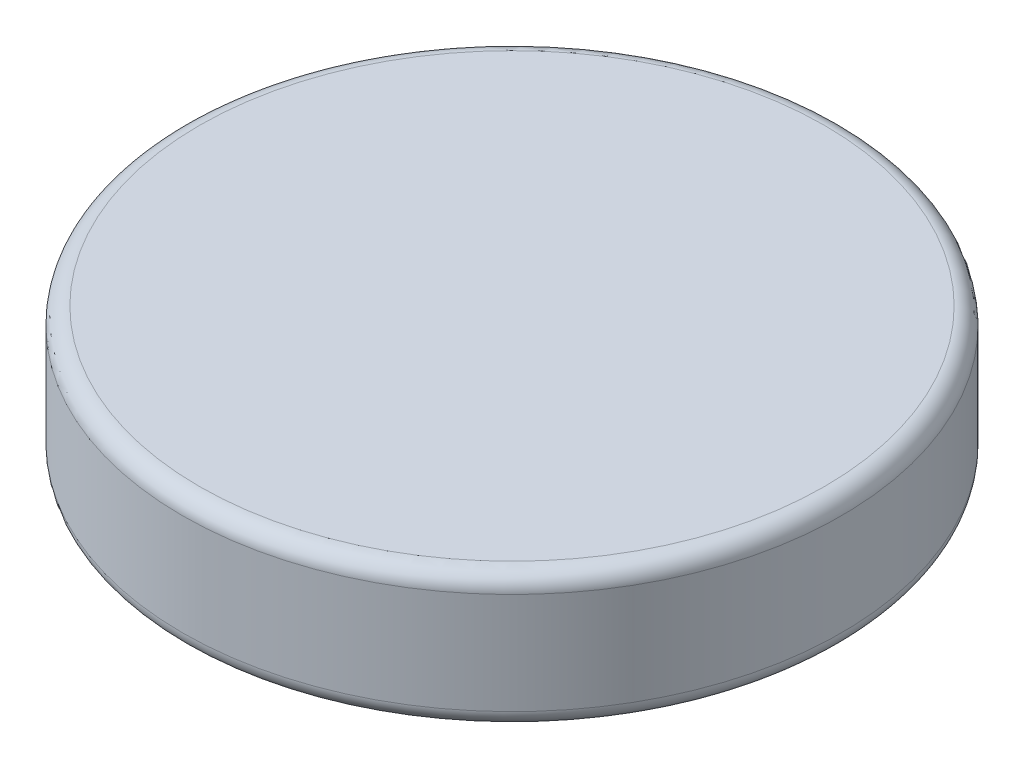
ISO-10303-21;
HEADER;
FILE_DESCRIPTION(('STEP AP214'),'2;1');
FILE_NAME('part.step','',(''),(''),'','','');
FILE_SCHEMA(('AUTOMOTIVE_DESIGN { 1 0 10303 214 1 1 1 1 }'));
ENDSEC;
DATA;
#1=APPLICATION_CONTEXT('core data for automotive mechanical design processes');
#2=APPLICATION_PROTOCOL_DEFINITION('international standard','automotive_design',2000,#1);
#3=PRODUCT_CONTEXT('',#1,'mechanical');
#4=PRODUCT('Part','Part','',(#3));
#5=PRODUCT_RELATED_PRODUCT_CATEGORY('part','',(#4));
#6=PRODUCT_DEFINITION_FORMATION('','',#4);
#7=PRODUCT_DEFINITION_CONTEXT('part definition',#1,'design');
#8=PRODUCT_DEFINITION('design','',#6,#7);
#9=PRODUCT_DEFINITION_SHAPE('','',#8);
#10=(LENGTH_UNIT() NAMED_UNIT(*) SI_UNIT(.MILLI.,.METRE.));
#11=(NAMED_UNIT(*) PLANE_ANGLE_UNIT() SI_UNIT($,.RADIAN.));
#12=(NAMED_UNIT(*) SI_UNIT($,.STERADIAN.) SOLID_ANGLE_UNIT());
#13=UNCERTAINTY_MEASURE_WITH_UNIT(LENGTH_MEASURE(1.E-05),#10,'distance_accuracy_value','');
#14=(GEOMETRIC_REPRESENTATION_CONTEXT(3) GLOBAL_UNCERTAINTY_ASSIGNED_CONTEXT((#13)) GLOBAL_UNIT_ASSIGNED_CONTEXT((#10,
#11,#12)) REPRESENTATION_CONTEXT('',''));
#15=CARTESIAN_POINT('',(0.,0.,0.));
#16=DIRECTION('',(0.,0.,1.));
#17=DIRECTION('',(1.,0.,0.));
#18=AXIS2_PLACEMENT_3D('',#15,#16,#17);
#19=CARTESIAN_POINT('',(0.,2.032,0.));
#20=DIRECTION('',(0.,-1.,0.));
#21=DIRECTION('',(0.,0.,-1.));
#22=AXIS2_PLACEMENT_3D('',#19,#20,#21);
#23=CYLINDRICAL_SURFACE('',#22,4.953);
#24=CARTESIAN_POINT('',(0.,0.254,0.));
#25=DIRECTION('',(0.,1.,0.));
#26=DIRECTION('',(0.,0.,1.));
#27=AXIS2_PLACEMENT_3D('',#24,#25,#26);
#28=CIRCLE('',#27,4.953);
#29=CARTESIAN_POINT('',(0.,0.254,4.953));
#30=VERTEX_POINT('',#29);
#31=EDGE_CURVE('E53',#30,#30,#28,.T.);
#32=ORIENTED_EDGE('',*,*,#31,.T.);
#33=EDGE_LOOP('',(#32));
#34=FACE_BOUND('',#33,.T.);
#35=CARTESIAN_POINT('',(0.,1.778,0.));
#36=DIRECTION('',(0.,1.,0.));
#37=DIRECTION('',(0.,0.,1.));
#38=AXIS2_PLACEMENT_3D('',#35,#36,#37);
#39=CIRCLE('',#38,4.953);
#40=CARTESIAN_POINT('',(0.,1.778,4.953));
#41=VERTEX_POINT('',#40);
#42=EDGE_CURVE('E58',#41,#41,#39,.F.);
#43=ORIENTED_EDGE('',*,*,#42,.T.);
#44=EDGE_LOOP('',(#43));
#45=FACE_BOUND('',#44,.T.);
#46=ADVANCED_FACE('F40',(#34,#45),#23,.T.);
#47=CARTESIAN_POINT('',(0.,2.032,0.));
#48=DIRECTION('',(0.,1.,0.));
#49=DIRECTION('',(0.,0.,1.));
#50=AXIS2_PLACEMENT_3D('',#47,#48,#49);
#51=PLANE('',#50);
#52=CARTESIAN_POINT('',(0.,2.032,0.));
#53=DIRECTION('',(0.,1.,0.));
#54=DIRECTION('',(0.,0.,1.));
#55=AXIS2_PLACEMENT_3D('',#52,#53,#54);
#56=CIRCLE('',#55,4.699);
#57=CARTESIAN_POINT('',(0.,2.032,4.699));
#58=VERTEX_POINT('',#57);
#59=EDGE_CURVE('E10',#58,#58,#56,.T.);
#60=ORIENTED_EDGE('',*,*,#59,.T.);
#61=EDGE_LOOP('',(#60));
#62=FACE_BOUND('',#61,.T.);
#63=ADVANCED_FACE('F75',(#62),#51,.T.);
#64=CARTESIAN_POINT('',(0.,0.,0.));
#65=DIRECTION('',(0.,1.,0.));
#66=DIRECTION('',(0.,0.,1.));
#67=AXIS2_PLACEMENT_3D('',#64,#65,#66);
#68=PLANE('',#67);
#69=CARTESIAN_POINT('',(0.,0.,0.));
#70=DIRECTION('',(0.,1.,0.));
#71=DIRECTION('',(0.,0.,1.));
#72=AXIS2_PLACEMENT_3D('',#69,#70,#71);
#73=CIRCLE('',#72,4.699);
#74=CARTESIAN_POINT('',(0.,0.,4.699));
#75=VERTEX_POINT('',#74);
#76=EDGE_CURVE('E48',#75,#75,#73,.F.);
#77=ORIENTED_EDGE('',*,*,#76,.T.);
#78=EDGE_LOOP('',(#77));
#79=FACE_BOUND('',#78,.T.);
#80=ADVANCED_FACE('F72',(#79),#68,.F.);
#81=CARTESIAN_POINT('',(0.,0.254,0.));
#82=DIRECTION('',(0.,1.,0.));
#83=DIRECTION('',(0.,0.,1.));
#84=AXIS2_PLACEMENT_3D('',#81,#82,#83);
#85=TOROIDAL_SURFACE('',#84,4.699,0.254);
#86=ORIENTED_EDGE('',*,*,#76,.F.);
#87=EDGE_LOOP('',(#86));
#88=FACE_BOUND('',#87,.T.);
#89=ORIENTED_EDGE('',*,*,#31,.F.);
#90=EDGE_LOOP('',(#89));
#91=FACE_BOUND('',#90,.T.);
#92=ADVANCED_FACE('F68',(#88,#91),#85,.T.);
#93=CARTESIAN_POINT('',(0.,1.778,0.));
#94=DIRECTION('',(0.,1.,0.));
#95=DIRECTION('',(0.,0.,1.));
#96=AXIS2_PLACEMENT_3D('',#93,#94,#95);
#97=TOROIDAL_SURFACE('',#96,4.699,0.254);
#98=ORIENTED_EDGE('',*,*,#42,.F.);
#99=EDGE_LOOP('',(#98));
#100=FACE_BOUND('',#99,.T.);
#101=ORIENTED_EDGE('',*,*,#59,.F.);
#102=EDGE_LOOP('',(#101));
#103=FACE_BOUND('',#102,.T.);
#104=ADVANCED_FACE('F42',(#100,#103),#97,.T.);
#105=CLOSED_SHELL('',(#46,#63,#80,#92,#104));
#106=MANIFOLD_SOLID_BREP('B2',#105);
#107=ADVANCED_BREP_SHAPE_REPRESENTATION('',(#18,#106),#14);
#108=SHAPE_DEFINITION_REPRESENTATION(#9,#107);
ENDSEC;
END-ISO-10303-21;
